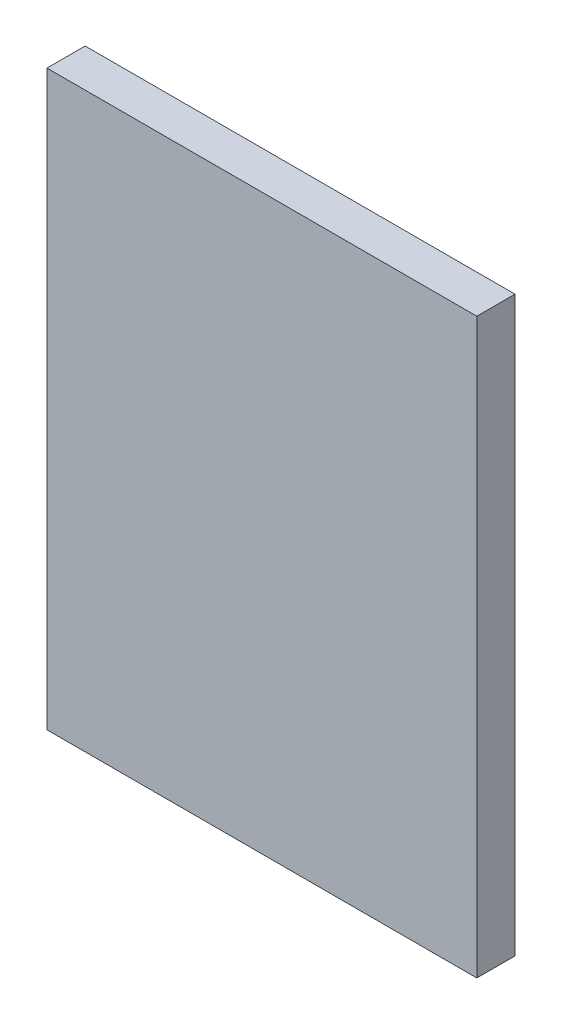
ISO-10303-21;
HEADER;
FILE_DESCRIPTION(('STEP AP214'),'2;1');
FILE_NAME('part.step','',(''),(''),'','','');
FILE_SCHEMA(('AUTOMOTIVE_DESIGN { 1 0 10303 214 1 1 1 1 }'));
ENDSEC;
DATA;
#1=APPLICATION_CONTEXT('core data for automotive mechanical design processes');
#2=APPLICATION_PROTOCOL_DEFINITION('international standard','automotive_design',2000,#1);
#3=PRODUCT_CONTEXT('',#1,'mechanical');
#4=PRODUCT('Part','Part','',(#3));
#5=PRODUCT_RELATED_PRODUCT_CATEGORY('part','',(#4));
#6=PRODUCT_DEFINITION_FORMATION('','',#4);
#7=PRODUCT_DEFINITION_CONTEXT('part definition',#1,'design');
#8=PRODUCT_DEFINITION('design','',#6,#7);
#9=PRODUCT_DEFINITION_SHAPE('','',#8);
#10=(LENGTH_UNIT() NAMED_UNIT(*) SI_UNIT(.MILLI.,.METRE.));
#11=(NAMED_UNIT(*) PLANE_ANGLE_UNIT() SI_UNIT($,.RADIAN.));
#12=(NAMED_UNIT(*) SI_UNIT($,.STERADIAN.) SOLID_ANGLE_UNIT());
#13=UNCERTAINTY_MEASURE_WITH_UNIT(LENGTH_MEASURE(1.E-05),#10,'distance_accuracy_value','');
#14=(GEOMETRIC_REPRESENTATION_CONTEXT(3) GLOBAL_UNCERTAINTY_ASSIGNED_CONTEXT((#13)) GLOBAL_UNIT_ASSIGNED_CONTEXT((#10,
#11,#12)) REPRESENTATION_CONTEXT('',''));
#15=CARTESIAN_POINT('',(0.,0.,0.));
#16=DIRECTION('',(0.,0.,1.));
#17=DIRECTION('',(1.,0.,0.));
#18=AXIS2_PLACEMENT_3D('',#15,#16,#17);
#19=CARTESIAN_POINT('',(0.,0.,0.));
#20=DIRECTION('',(0.,0.,-1.));
#21=DIRECTION('',(0.,-1.,0.));
#22=AXIS2_PLACEMENT_3D('',#19,#20,#21);
#23=PLANE('',#22);
#24=DIRECTION('',(0.,-1.,0.));
#25=VECTOR('',#24,1.);
#26=CARTESIAN_POINT('',(0.,0.,0.));
#27=LINE('',#26,#25);
#28=CARTESIAN_POINT('',(0.,30.,0.));
#29=VERTEX_POINT('',#28);
#30=CARTESIAN_POINT('',(0.,0.,0.));
#31=VERTEX_POINT('',#30);
#32=EDGE_CURVE('E82',#29,#31,#27,.T.);
#33=ORIENTED_EDGE('',*,*,#32,.F.);
#34=DIRECTION('',(-1.,0.,0.));
#35=VECTOR('',#34,1.);
#36=CARTESIAN_POINT('',(0.,30.,0.));
#37=LINE('',#36,#35);
#38=CARTESIAN_POINT('',(22.5,30.,0.));
#39=VERTEX_POINT('',#38);
#40=EDGE_CURVE('E19',#39,#29,#37,.T.);
#41=ORIENTED_EDGE('',*,*,#40,.F.);
#42=DIRECTION('',(0.,1.,0.));
#43=VECTOR('',#42,1.);
#44=CARTESIAN_POINT('',(22.5,0.,0.));
#45=LINE('',#44,#43);
#46=CARTESIAN_POINT('',(22.5,0.,0.));
#47=VERTEX_POINT('',#46);
#48=EDGE_CURVE('E112',#47,#39,#45,.T.);
#49=ORIENTED_EDGE('',*,*,#48,.F.);
#50=DIRECTION('',(1.,0.,0.));
#51=VECTOR('',#50,1.);
#52=CARTESIAN_POINT('',(0.,0.,0.));
#53=LINE('',#52,#51);
#54=EDGE_CURVE('E86',#31,#47,#53,.T.);
#55=ORIENTED_EDGE('',*,*,#54,.F.);
#56=EDGE_LOOP('',(#33,#41,#49,#55));
#57=FACE_BOUND('',#56,.T.);
#58=ADVANCED_FACE('F16',(#57),#23,.T.);
#59=CARTESIAN_POINT('',(0.,0.,2.));
#60=DIRECTION('',(0.,0.,-1.));
#61=DIRECTION('',(0.,-1.,0.));
#62=AXIS2_PLACEMENT_3D('',#59,#60,#61);
#63=PLANE('',#62);
#64=DIRECTION('',(0.,-1.,0.));
#65=VECTOR('',#64,1.);
#66=CARTESIAN_POINT('',(0.,0.,2.));
#67=LINE('',#66,#65);
#68=CARTESIAN_POINT('',(0.,30.,2.));
#69=VERTEX_POINT('',#68);
#70=CARTESIAN_POINT('',(0.,0.,2.));
#71=VERTEX_POINT('',#70);
#72=EDGE_CURVE('E84',#69,#71,#67,.T.);
#73=ORIENTED_EDGE('',*,*,#72,.T.);
#74=DIRECTION('',(1.,0.,0.));
#75=VECTOR('',#74,1.);
#76=CARTESIAN_POINT('',(0.,0.,2.));
#77=LINE('',#76,#75);
#78=CARTESIAN_POINT('',(22.5,0.,2.));
#79=VERTEX_POINT('',#78);
#80=EDGE_CURVE('E106',#71,#79,#77,.T.);
#81=ORIENTED_EDGE('',*,*,#80,.T.);
#82=DIRECTION('',(0.,1.,0.));
#83=VECTOR('',#82,1.);
#84=CARTESIAN_POINT('',(22.5,0.,2.));
#85=LINE('',#84,#83);
#86=CARTESIAN_POINT('',(22.5,30.,2.));
#87=VERTEX_POINT('',#86);
#88=EDGE_CURVE('E77',#79,#87,#85,.T.);
#89=ORIENTED_EDGE('',*,*,#88,.T.);
#90=DIRECTION('',(-1.,0.,0.));
#91=VECTOR('',#90,1.);
#92=CARTESIAN_POINT('',(0.,30.,2.));
#93=LINE('',#92,#91);
#94=EDGE_CURVE('E10',#87,#69,#93,.T.);
#95=ORIENTED_EDGE('',*,*,#94,.T.);
#96=EDGE_LOOP('',(#73,#81,#89,#95));
#97=FACE_BOUND('',#96,.T.);
#98=ADVANCED_FACE('F164',(#97),#63,.F.);
#99=CARTESIAN_POINT('',(0.,30.,2.));
#100=DIRECTION('',(0.,-1.,0.));
#101=DIRECTION('',(0.,0.,-1.));
#102=AXIS2_PLACEMENT_3D('',#99,#100,#101);
#103=PLANE('',#102);
#104=ORIENTED_EDGE('',*,*,#40,.T.);
#105=DIRECTION('',(0.,0.,-1.));
#106=VECTOR('',#105,1.);
#107=CARTESIAN_POINT('',(0.,30.,2.));
#108=LINE('',#107,#106);
#109=EDGE_CURVE('E71',#69,#29,#108,.T.);
#110=ORIENTED_EDGE('',*,*,#109,.F.);
#111=ORIENTED_EDGE('',*,*,#94,.F.);
#112=DIRECTION('',(0.,0.,-1.));
#113=VECTOR('',#112,1.);
#114=CARTESIAN_POINT('',(22.5,30.,2.));
#115=LINE('',#114,#113);
#116=EDGE_CURVE('E74',#87,#39,#115,.T.);
#117=ORIENTED_EDGE('',*,*,#116,.T.);
#118=EDGE_LOOP('',(#104,#110,#111,#117));
#119=FACE_BOUND('',#118,.T.);
#120=ADVANCED_FACE('F70',(#119),#103,.F.);
#121=CARTESIAN_POINT('',(22.5,0.,2.));
#122=DIRECTION('',(-1.,0.,0.));
#123=DIRECTION('',(0.,0.,1.));
#124=AXIS2_PLACEMENT_3D('',#121,#122,#123);
#125=PLANE('',#124);
#126=ORIENTED_EDGE('',*,*,#48,.T.);
#127=ORIENTED_EDGE('',*,*,#116,.F.);
#128=ORIENTED_EDGE('',*,*,#88,.F.);
#129=DIRECTION('',(0.,0.,-1.));
#130=VECTOR('',#129,1.);
#131=CARTESIAN_POINT('',(22.5,0.,2.));
#132=LINE('',#131,#130);
#133=EDGE_CURVE('E102',#79,#47,#132,.T.);
#134=ORIENTED_EDGE('',*,*,#133,.T.);
#135=EDGE_LOOP('',(#126,#127,#128,#134));
#136=FACE_BOUND('',#135,.T.);
#137=ADVANCED_FACE('F143',(#136),#125,.F.);
#138=CARTESIAN_POINT('',(0.,0.,2.));
#139=DIRECTION('',(0.,1.,0.));
#140=DIRECTION('',(1.,0.,0.));
#141=AXIS2_PLACEMENT_3D('',#138,#139,#140);
#142=PLANE('',#141);
#143=ORIENTED_EDGE('',*,*,#54,.T.);
#144=ORIENTED_EDGE('',*,*,#133,.F.);
#145=ORIENTED_EDGE('',*,*,#80,.F.);
#146=DIRECTION('',(0.,0.,-1.));
#147=VECTOR('',#146,1.);
#148=CARTESIAN_POINT('',(0.,0.,2.));
#149=LINE('',#148,#147);
#150=EDGE_CURVE('E91',#71,#31,#149,.T.);
#151=ORIENTED_EDGE('',*,*,#150,.T.);
#152=EDGE_LOOP('',(#143,#144,#145,#151));
#153=FACE_BOUND('',#152,.T.);
#154=ADVANCED_FACE('F132',(#153),#142,.F.);
#155=CARTESIAN_POINT('',(0.,0.,2.));
#156=DIRECTION('',(1.,0.,0.));
#157=DIRECTION('',(0.,1.,0.));
#158=AXIS2_PLACEMENT_3D('',#155,#156,#157);
#159=PLANE('',#158);
#160=ORIENTED_EDGE('',*,*,#32,.T.);
#161=ORIENTED_EDGE('',*,*,#150,.F.);
#162=ORIENTED_EDGE('',*,*,#72,.F.);
#163=ORIENTED_EDGE('',*,*,#109,.T.);
#164=EDGE_LOOP('',(#160,#161,#162,#163));
#165=FACE_BOUND('',#164,.T.);
#166=ADVANCED_FACE('F80',(#165),#159,.F.);
#167=CLOSED_SHELL('',(#58,#98,#120,#137,#154,#166));
#168=MANIFOLD_SOLID_BREP('B1',#167);
#169=ADVANCED_BREP_SHAPE_REPRESENTATION('',(#18,#168),#14);
#170=SHAPE_DEFINITION_REPRESENTATION(#9,#169);
ENDSEC;
END-ISO-10303-21;
